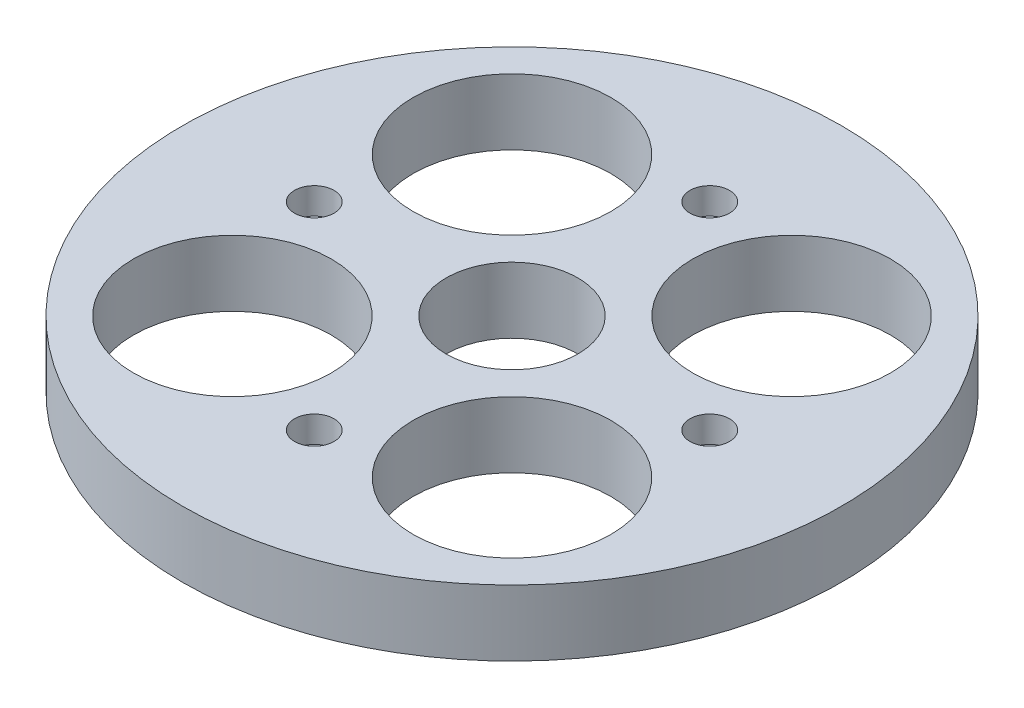
ISO-10303-21;
HEADER;
FILE_DESCRIPTION(('STEP AP214'),'2;1');
FILE_NAME('part.step','',(''),(''),'','','');
FILE_SCHEMA(('AUTOMOTIVE_DESIGN { 1 0 10303 214 1 1 1 1 }'));
ENDSEC;
DATA;
#1=APPLICATION_CONTEXT('core data for automotive mechanical design processes');
#2=APPLICATION_PROTOCOL_DEFINITION('international standard','automotive_design',2000,#1);
#3=PRODUCT_CONTEXT('',#1,'mechanical');
#4=PRODUCT('Part','Part','',(#3));
#5=PRODUCT_RELATED_PRODUCT_CATEGORY('part','',(#4));
#6=PRODUCT_DEFINITION_FORMATION('','',#4);
#7=PRODUCT_DEFINITION_CONTEXT('part definition',#1,'design');
#8=PRODUCT_DEFINITION('design','',#6,#7);
#9=PRODUCT_DEFINITION_SHAPE('','',#8);
#10=(LENGTH_UNIT() NAMED_UNIT(*) SI_UNIT(.MILLI.,.METRE.));
#11=(NAMED_UNIT(*) PLANE_ANGLE_UNIT() SI_UNIT($,.RADIAN.));
#12=(NAMED_UNIT(*) SI_UNIT($,.STERADIAN.) SOLID_ANGLE_UNIT());
#13=UNCERTAINTY_MEASURE_WITH_UNIT(LENGTH_MEASURE(1.E-05),#10,'distance_accuracy_value','');
#14=(GEOMETRIC_REPRESENTATION_CONTEXT(3) GLOBAL_UNCERTAINTY_ASSIGNED_CONTEXT((#13)) GLOBAL_UNIT_ASSIGNED_CONTEXT((#10,
#11,#12)) REPRESENTATION_CONTEXT('',''));
#15=CARTESIAN_POINT('',(0.,0.,0.));
#16=DIRECTION('',(0.,0.,1.));
#17=DIRECTION('',(1.,0.,0.));
#18=AXIS2_PLACEMENT_3D('',#15,#16,#17);
#19=CARTESIAN_POINT('',(-30.,0.,-3.14233320495882E-13));
#20=DIRECTION('',(0.,1.,0.));
#21=DIRECTION('',(0.,0.,1.));
#22=AXIS2_PLACEMENT_3D('',#19,#20,#21);
#23=CYLINDRICAL_SURFACE('',#22,1.5);
#24=CARTESIAN_POINT('',(-30.,6.,-3.14233320495882E-13));
#25=DIRECTION('',(0.,1.,0.));
#26=DIRECTION('',(0.,0.,1.));
#27=AXIS2_PLACEMENT_3D('',#24,#25,#26);
#28=CIRCLE('',#27,1.5);
#29=CARTESIAN_POINT('',(-30.,6.,1.49999999999969));
#30=VERTEX_POINT('',#29);
#31=EDGE_CURVE('E75',#30,#30,#28,.T.);
#32=ORIENTED_EDGE('',*,*,#31,.T.);
#33=EDGE_LOOP('',(#32));
#34=FACE_BOUND('',#33,.T.);
#35=CARTESIAN_POINT('',(-30.,3.,-3.14233320495882E-13));
#36=DIRECTION('',(0.,-1.,0.));
#37=DIRECTION('',(0.,0.,-1.));
#38=AXIS2_PLACEMENT_3D('',#35,#36,#37);
#39=CIRCLE('',#38,1.5);
#40=CARTESIAN_POINT('',(-30.,3.,-1.50000000000031));
#41=VERTEX_POINT('',#40);
#42=EDGE_CURVE('E45',#41,#41,#39,.F.);
#43=ORIENTED_EDGE('',*,*,#42,.F.);
#44=EDGE_LOOP('',(#43));
#45=FACE_BOUND('',#44,.T.);
#46=ADVANCED_FACE('F41',(#34,#45),#23,.F.);
#47=CARTESIAN_POINT('',(-2.09488880330588E-13,0.,30.));
#48=DIRECTION('',(0.,1.,0.));
#49=DIRECTION('',(0.,0.,1.));
#50=AXIS2_PLACEMENT_3D('',#47,#48,#49);
#51=CYLINDRICAL_SURFACE('',#50,1.5);
#52=CARTESIAN_POINT('',(-2.09488880330588E-13,6.,30.));
#53=DIRECTION('',(0.,1.,0.));
#54=DIRECTION('',(0.,0.,1.));
#55=AXIS2_PLACEMENT_3D('',#52,#53,#54);
#56=CIRCLE('',#55,1.5);
#57=CARTESIAN_POINT('',(-2.09488880330588E-13,6.,31.5));
#58=VERTEX_POINT('',#57);
#59=EDGE_CURVE('E79',#58,#58,#56,.T.);
#60=ORIENTED_EDGE('',*,*,#59,.T.);
#61=EDGE_LOOP('',(#60));
#62=FACE_BOUND('',#61,.T.);
#63=CARTESIAN_POINT('',(-2.09488880330588E-13,3.,30.));
#64=DIRECTION('',(0.,-1.,0.));
#65=DIRECTION('',(0.,0.,-1.));
#66=AXIS2_PLACEMENT_3D('',#63,#64,#65);
#67=CIRCLE('',#66,1.5);
#68=CARTESIAN_POINT('',(-2.09488880330588E-13,3.,28.5));
#69=VERTEX_POINT('',#68);
#70=EDGE_CURVE('E70',#69,#69,#67,.F.);
#71=ORIENTED_EDGE('',*,*,#70,.F.);
#72=EDGE_LOOP('',(#71));
#73=FACE_BOUND('',#72,.T.);
#74=ADVANCED_FACE('F212',(#62,#73),#51,.F.);
#75=CARTESIAN_POINT('',(30.,0.,1.04744440165294E-13));
#76=DIRECTION('',(0.,1.,0.));
#77=DIRECTION('',(0.,0.,1.));
#78=AXIS2_PLACEMENT_3D('',#75,#76,#77);
#79=CYLINDRICAL_SURFACE('',#78,1.5);
#80=CARTESIAN_POINT('',(30.,6.,1.04744440165294E-13));
#81=DIRECTION('',(0.,1.,0.));
#82=DIRECTION('',(0.,0.,1.));
#83=AXIS2_PLACEMENT_3D('',#80,#81,#82);
#84=CIRCLE('',#83,1.5);
#85=CARTESIAN_POINT('',(30.,6.,1.50000000000011));
#86=VERTEX_POINT('',#85);
#87=EDGE_CURVE('E84',#86,#86,#84,.T.);
#88=ORIENTED_EDGE('',*,*,#87,.T.);
#89=EDGE_LOOP('',(#88));
#90=FACE_BOUND('',#89,.T.);
#91=CARTESIAN_POINT('',(30.,3.,1.04744440165294E-13));
#92=DIRECTION('',(0.,-1.,0.));
#93=DIRECTION('',(0.,0.,-1.));
#94=AXIS2_PLACEMENT_3D('',#91,#92,#93);
#95=CIRCLE('',#94,1.5);
#96=CARTESIAN_POINT('',(30.,3.,-1.4999999999999));
#97=VERTEX_POINT('',#96);
#98=EDGE_CURVE('E67',#97,#97,#95,.F.);
#99=ORIENTED_EDGE('',*,*,#98,.F.);
#100=EDGE_LOOP('',(#99));
#101=FACE_BOUND('',#100,.T.);
#102=ADVANCED_FACE('F218',(#90,#101),#79,.F.);
#103=CARTESIAN_POINT('',(0.,0.,-30.));
#104=DIRECTION('',(0.,1.,0.));
#105=DIRECTION('',(0.,0.,1.));
#106=AXIS2_PLACEMENT_3D('',#103,#104,#105);
#107=CYLINDRICAL_SURFACE('',#106,1.5);
#108=CARTESIAN_POINT('',(0.,6.,-30.));
#109=DIRECTION('',(0.,1.,0.));
#110=DIRECTION('',(0.,0.,1.));
#111=AXIS2_PLACEMENT_3D('',#108,#109,#110);
#112=CIRCLE('',#111,1.5);
#113=CARTESIAN_POINT('',(0.,6.,-28.5));
#114=VERTEX_POINT('',#113);
#115=EDGE_CURVE('E109',#114,#114,#112,.T.);
#116=ORIENTED_EDGE('',*,*,#115,.T.);
#117=EDGE_LOOP('',(#116));
#118=FACE_BOUND('',#117,.T.);
#119=CARTESIAN_POINT('',(0.,3.,-30.));
#120=DIRECTION('',(0.,-1.,0.));
#121=DIRECTION('',(0.,0.,-1.));
#122=AXIS2_PLACEMENT_3D('',#119,#120,#121);
#123=CIRCLE('',#122,1.5);
#124=CARTESIAN_POINT('',(0.,3.,-31.5));
#125=VERTEX_POINT('',#124);
#126=EDGE_CURVE('E64',#125,#125,#123,.F.);
#127=ORIENTED_EDGE('',*,*,#126,.F.);
#128=EDGE_LOOP('',(#127));
#129=FACE_BOUND('',#128,.T.);
#130=ADVANCED_FACE('F197',(#118,#129),#107,.F.);
#131=CARTESIAN_POINT('',(0.,10.,0.));
#132=DIRECTION('',(0.,-1.,0.));
#133=DIRECTION('',(0.,0.,-1.));
#134=AXIS2_PLACEMENT_3D('',#131,#132,#133);
#135=CYLINDRICAL_SURFACE('',#134,50.);
#136=CARTESIAN_POINT('',(0.,10.,0.));
#137=DIRECTION('',(0.,1.,0.));
#138=DIRECTION('',(0.,0.,1.));
#139=AXIS2_PLACEMENT_3D('',#136,#137,#138);
#140=CIRCLE('',#139,50.);
#141=CARTESIAN_POINT('',(0.,10.,50.));
#142=VERTEX_POINT('',#141);
#143=EDGE_CURVE('E49',#142,#142,#140,.T.);
#144=ORIENTED_EDGE('',*,*,#143,.F.);
#145=EDGE_LOOP('',(#144));
#146=FACE_BOUND('',#145,.T.);
#147=CARTESIAN_POINT('',(0.,0.,0.));
#148=DIRECTION('',(0.,1.,0.));
#149=DIRECTION('',(0.,0.,1.));
#150=AXIS2_PLACEMENT_3D('',#147,#148,#149);
#151=CIRCLE('',#150,50.);
#152=CARTESIAN_POINT('',(0.,0.,50.));
#153=VERTEX_POINT('',#152);
#154=EDGE_CURVE('E58',#153,#153,#151,.T.);
#155=ORIENTED_EDGE('',*,*,#154,.T.);
#156=EDGE_LOOP('',(#155));
#157=FACE_BOUND('',#156,.T.);
#158=ADVANCED_FACE('F43',(#146,#157),#135,.T.);
#159=CARTESIAN_POINT('',(0.,10.,0.));
#160=DIRECTION('',(0.,-1.,0.));
#161=DIRECTION('',(0.,0.,-1.));
#162=AXIS2_PLACEMENT_3D('',#159,#160,#161);
#163=CYLINDRICAL_SURFACE('',#162,10.);
#164=CARTESIAN_POINT('',(0.,10.,0.));
#165=DIRECTION('',(0.,1.,0.));
#166=DIRECTION('',(0.,0.,1.));
#167=AXIS2_PLACEMENT_3D('',#164,#165,#166);
#168=CIRCLE('',#167,10.);
#169=CARTESIAN_POINT('',(0.,10.,10.));
#170=VERTEX_POINT('',#169);
#171=EDGE_CURVE('E10',#170,#170,#168,.T.);
#172=ORIENTED_EDGE('',*,*,#171,.T.);
#173=EDGE_LOOP('',(#172));
#174=FACE_BOUND('',#173,.T.);
#175=CARTESIAN_POINT('',(0.,0.,0.));
#176=DIRECTION('',(0.,1.,0.));
#177=DIRECTION('',(0.,0.,1.));
#178=AXIS2_PLACEMENT_3D('',#175,#176,#177);
#179=CIRCLE('',#178,10.);
#180=CARTESIAN_POINT('',(0.,0.,10.));
#181=VERTEX_POINT('',#180);
#182=EDGE_CURVE('E54',#181,#181,#179,.T.);
#183=ORIENTED_EDGE('',*,*,#182,.F.);
#184=EDGE_LOOP('',(#183));
#185=FACE_BOUND('',#184,.T.);
#186=ADVANCED_FACE('F180',(#174,#185),#163,.F.);
#187=CARTESIAN_POINT('',(0.,10.,0.));
#188=DIRECTION('',(0.,1.,0.));
#189=DIRECTION('',(0.,0.,1.));
#190=AXIS2_PLACEMENT_3D('',#187,#188,#189);
#191=PLANE('',#190);
#192=CARTESIAN_POINT('',(-21.2132034355965,10.,21.2132034355963));
#193=DIRECTION('',(0.,1.,0.));
#194=DIRECTION('',(0.,0.,1.));
#195=AXIS2_PLACEMENT_3D('',#192,#193,#194);
#196=CIRCLE('',#195,15.);
#197=CARTESIAN_POINT('',(-21.2132034355965,10.,36.2132034355963));
#198=VERTEX_POINT('',#197);
#199=EDGE_CURVE('E148',#198,#198,#196,.T.);
#200=ORIENTED_EDGE('',*,*,#199,.F.);
#201=EDGE_LOOP('',(#200));
#202=FACE_BOUND('',#201,.T.);
#203=CARTESIAN_POINT('',(21.2132034355964,10.,21.2132034355965));
#204=DIRECTION('',(0.,1.,0.));
#205=DIRECTION('',(0.,0.,1.));
#206=AXIS2_PLACEMENT_3D('',#203,#204,#205);
#207=CIRCLE('',#206,15.);
#208=CARTESIAN_POINT('',(21.2132034355964,10.,36.2132034355965));
#209=VERTEX_POINT('',#208);
#210=EDGE_CURVE('E154',#209,#209,#207,.T.);
#211=ORIENTED_EDGE('',*,*,#210,.F.);
#212=EDGE_LOOP('',(#211));
#213=FACE_BOUND('',#212,.T.);
#214=CARTESIAN_POINT('',(21.2132034355964,10.,-21.2132034355965));
#215=DIRECTION('',(0.,1.,0.));
#216=DIRECTION('',(0.,0.,1.));
#217=AXIS2_PLACEMENT_3D('',#214,#215,#216);
#218=CIRCLE('',#217,15.);
#219=CARTESIAN_POINT('',(21.2132034355964,10.,-6.21320343559645));
#220=VERTEX_POINT('',#219);
#221=EDGE_CURVE('E160',#220,#220,#218,.T.);
#222=ORIENTED_EDGE('',*,*,#221,.F.);
#223=EDGE_LOOP('',(#222));
#224=FACE_BOUND('',#223,.T.);
#225=CARTESIAN_POINT('',(-21.2132034355962,10.,-21.2132034355966));
#226=DIRECTION('',(0.,1.,0.));
#227=DIRECTION('',(0.,0.,1.));
#228=AXIS2_PLACEMENT_3D('',#225,#226,#227);
#229=CIRCLE('',#228,15.);
#230=CARTESIAN_POINT('',(-21.2132034355962,10.,-6.2132034355966));
#231=VERTEX_POINT('',#230);
#232=EDGE_CURVE('E142',#231,#231,#229,.T.);
#233=ORIENTED_EDGE('',*,*,#232,.F.);
#234=EDGE_LOOP('',(#233));
#235=FACE_BOUND('',#234,.T.);
#236=CARTESIAN_POINT('',(0.,10.,-30.));
#237=DIRECTION('',(0.,1.,0.));
#238=DIRECTION('',(0.,0.,1.));
#239=AXIS2_PLACEMENT_3D('',#236,#237,#238);
#240=CIRCLE('',#239,3.);
#241=CARTESIAN_POINT('',(0.,10.,-27.));
#242=VERTEX_POINT('',#241);
#243=EDGE_CURVE('E90',#242,#242,#240,.T.);
#244=ORIENTED_EDGE('',*,*,#243,.F.);
#245=EDGE_LOOP('',(#244));
#246=FACE_BOUND('',#245,.T.);
#247=CARTESIAN_POINT('',(30.,10.,1.04744440165294E-13));
#248=DIRECTION('',(0.,1.,0.));
#249=DIRECTION('',(0.,0.,1.));
#250=AXIS2_PLACEMENT_3D('',#247,#248,#249);
#251=CIRCLE('',#250,3.);
#252=CARTESIAN_POINT('',(30.,10.,3.0000000000001));
#253=VERTEX_POINT('',#252);
#254=EDGE_CURVE('E96',#253,#253,#251,.T.);
#255=ORIENTED_EDGE('',*,*,#254,.F.);
#256=EDGE_LOOP('',(#255));
#257=FACE_BOUND('',#256,.T.);
#258=CARTESIAN_POINT('',(-30.,10.,-3.14233320495882E-13));
#259=DIRECTION('',(0.,1.,0.));
#260=DIRECTION('',(0.,0.,1.));
#261=AXIS2_PLACEMENT_3D('',#258,#259,#260);
#262=CIRCLE('',#261,3.);
#263=CARTESIAN_POINT('',(-30.,10.,2.99999999999968));
#264=VERTEX_POINT('',#263);
#265=EDGE_CURVE('E102',#264,#264,#262,.T.);
#266=ORIENTED_EDGE('',*,*,#265,.F.);
#267=EDGE_LOOP('',(#266));
#268=FACE_BOUND('',#267,.T.);
#269=CARTESIAN_POINT('',(-2.09488880330588E-13,10.,30.));
#270=DIRECTION('',(0.,1.,0.));
#271=DIRECTION('',(0.,0.,1.));
#272=AXIS2_PLACEMENT_3D('',#269,#270,#271);
#273=CIRCLE('',#272,3.);
#274=CARTESIAN_POINT('',(-2.09488880330588E-13,10.,33.));
#275=VERTEX_POINT('',#274);
#276=EDGE_CURVE('E107',#275,#275,#273,.T.);
#277=ORIENTED_EDGE('',*,*,#276,.F.);
#278=EDGE_LOOP('',(#277));
#279=FACE_BOUND('',#278,.T.);
#280=ORIENTED_EDGE('',*,*,#143,.T.);
#281=EDGE_LOOP('',(#280));
#282=FACE_BOUND('',#281,.T.);
#283=ORIENTED_EDGE('',*,*,#171,.F.);
#284=EDGE_LOOP('',(#283));
#285=FACE_BOUND('',#284,.T.);
#286=ADVANCED_FACE('F177',(#202,#213,#224,#235,#246,#257,#268,#279,#282,#285),#191,.T.);
#287=CARTESIAN_POINT('',(0.,0.,0.));
#288=DIRECTION('',(0.,1.,0.));
#289=DIRECTION('',(0.,0.,1.));
#290=AXIS2_PLACEMENT_3D('',#287,#288,#289);
#291=PLANE('',#290);
#292=CARTESIAN_POINT('',(-21.2132034355965,0.,21.2132034355963));
#293=DIRECTION('',(0.,1.,0.));
#294=DIRECTION('',(0.,0.,1.));
#295=AXIS2_PLACEMENT_3D('',#292,#293,#294);
#296=CIRCLE('',#295,15.);
#297=CARTESIAN_POINT('',(-21.2132034355965,0.,36.2132034355963));
#298=VERTEX_POINT('',#297);
#299=EDGE_CURVE('E151',#298,#298,#296,.T.);
#300=ORIENTED_EDGE('',*,*,#299,.T.);
#301=EDGE_LOOP('',(#300));
#302=FACE_BOUND('',#301,.T.);
#303=CARTESIAN_POINT('',(21.2132034355964,0.,21.2132034355965));
#304=DIRECTION('',(0.,1.,0.));
#305=DIRECTION('',(0.,0.,1.));
#306=AXIS2_PLACEMENT_3D('',#303,#304,#305);
#307=CIRCLE('',#306,15.);
#308=CARTESIAN_POINT('',(21.2132034355964,0.,36.2132034355965));
#309=VERTEX_POINT('',#308);
#310=EDGE_CURVE('E157',#309,#309,#307,.T.);
#311=ORIENTED_EDGE('',*,*,#310,.T.);
#312=EDGE_LOOP('',(#311));
#313=FACE_BOUND('',#312,.T.);
#314=CARTESIAN_POINT('',(21.2132034355964,0.,-21.2132034355965));
#315=DIRECTION('',(0.,1.,0.));
#316=DIRECTION('',(0.,0.,1.));
#317=AXIS2_PLACEMENT_3D('',#314,#315,#316);
#318=CIRCLE('',#317,15.);
#319=CARTESIAN_POINT('',(21.2132034355964,0.,-6.21320343559645));
#320=VERTEX_POINT('',#319);
#321=EDGE_CURVE('E145',#320,#320,#318,.T.);
#322=ORIENTED_EDGE('',*,*,#321,.T.);
#323=EDGE_LOOP('',(#322));
#324=FACE_BOUND('',#323,.T.);
#325=CARTESIAN_POINT('',(-21.2132034355962,0.,-21.2132034355966));
#326=DIRECTION('',(0.,1.,0.));
#327=DIRECTION('',(0.,0.,1.));
#328=AXIS2_PLACEMENT_3D('',#325,#326,#327);
#329=CIRCLE('',#328,15.);
#330=CARTESIAN_POINT('',(-21.2132034355962,0.,-6.2132034355966));
#331=VERTEX_POINT('',#330);
#332=EDGE_CURVE('E122',#331,#331,#329,.T.);
#333=ORIENTED_EDGE('',*,*,#332,.T.);
#334=EDGE_LOOP('',(#333));
#335=FACE_BOUND('',#334,.T.);
#336=CARTESIAN_POINT('',(0.,0.,30.));
#337=DIRECTION('',(0.,-1.,0.));
#338=DIRECTION('',(0.,0.,-1.));
#339=AXIS2_PLACEMENT_3D('',#336,#337,#338);
#340=CIRCLE('',#339,3.);
#341=CARTESIAN_POINT('',(0.,0.,27.));
#342=VERTEX_POINT('',#341);
#343=EDGE_CURVE('E137',#342,#342,#340,.T.);
#344=ORIENTED_EDGE('',*,*,#343,.F.);
#345=EDGE_LOOP('',(#344));
#346=FACE_BOUND('',#345,.T.);
#347=CARTESIAN_POINT('',(30.,0.,-1.04744440165294E-13));
#348=DIRECTION('',(0.,-1.,0.));
#349=DIRECTION('',(0.,0.,-1.));
#350=AXIS2_PLACEMENT_3D('',#347,#348,#349);
#351=CIRCLE('',#350,3.);
#352=CARTESIAN_POINT('',(30.,0.,-3.0000000000001));
#353=VERTEX_POINT('',#352);
#354=EDGE_CURVE('E134',#353,#353,#351,.T.);
#355=ORIENTED_EDGE('',*,*,#354,.F.);
#356=EDGE_LOOP('',(#355));
#357=FACE_BOUND('',#356,.T.);
#358=CARTESIAN_POINT('',(-2.09488880330588E-13,0.,-30.));
#359=DIRECTION('',(0.,-1.,0.));
#360=DIRECTION('',(0.,0.,-1.));
#361=AXIS2_PLACEMENT_3D('',#358,#359,#360);
#362=CIRCLE('',#361,3.);
#363=CARTESIAN_POINT('',(-2.09488880330588E-13,0.,-33.));
#364=VERTEX_POINT('',#363);
#365=EDGE_CURVE('E128',#364,#364,#362,.T.);
#366=ORIENTED_EDGE('',*,*,#365,.F.);
#367=EDGE_LOOP('',(#366));
#368=FACE_BOUND('',#367,.T.);
#369=CARTESIAN_POINT('',(-30.,0.,3.14233320495882E-13));
#370=DIRECTION('',(0.,-1.,0.));
#371=DIRECTION('',(0.,0.,-1.));
#372=AXIS2_PLACEMENT_3D('',#369,#370,#371);
#373=CIRCLE('',#372,3.);
#374=CARTESIAN_POINT('',(-30.,0.,-2.99999999999968));
#375=VERTEX_POINT('',#374);
#376=EDGE_CURVE('E121',#375,#375,#373,.T.);
#377=ORIENTED_EDGE('',*,*,#376,.F.);
#378=EDGE_LOOP('',(#377));
#379=FACE_BOUND('',#378,.T.);
#380=ORIENTED_EDGE('',*,*,#154,.F.);
#381=EDGE_LOOP('',(#380));
#382=FACE_BOUND('',#381,.T.);
#383=ORIENTED_EDGE('',*,*,#182,.T.);
#384=EDGE_LOOP('',(#383));
#385=FACE_BOUND('',#384,.T.);
#386=ADVANCED_FACE('F166',(#302,#313,#324,#335,#346,#357,#368,#379,#382,#385),#291,.F.);
#387=CARTESIAN_POINT('',(-2.09488880330588E-13,6.,30.));
#388=DIRECTION('',(0.,1.,0.));
#389=DIRECTION('',(0.,0.,1.));
#390=AXIS2_PLACEMENT_3D('',#387,#388,#389);
#391=CYLINDRICAL_SURFACE('',#390,3.);
#392=CARTESIAN_POINT('',(-2.09488880330588E-13,6.,30.));
#393=DIRECTION('',(0.,1.,0.));
#394=DIRECTION('',(0.,0.,1.));
#395=AXIS2_PLACEMENT_3D('',#392,#393,#394);
#396=CIRCLE('',#395,3.);
#397=CARTESIAN_POINT('',(-2.09488880330588E-13,6.,33.));
#398=VERTEX_POINT('',#397);
#399=EDGE_CURVE('E105',#398,#398,#396,.T.);
#400=ORIENTED_EDGE('',*,*,#399,.F.);
#401=EDGE_LOOP('',(#400));
#402=FACE_BOUND('',#401,.T.);
#403=ORIENTED_EDGE('',*,*,#276,.T.);
#404=EDGE_LOOP('',(#403));
#405=FACE_BOUND('',#404,.T.);
#406=ADVANCED_FACE('F202',(#402,#405),#391,.F.);
#407=CARTESIAN_POINT('',(0.,6.,0.));
#408=DIRECTION('',(0.,1.,0.));
#409=DIRECTION('',(0.,0.,1.));
#410=AXIS2_PLACEMENT_3D('',#407,#408,#409);
#411=PLANE('',#410);
#412=ORIENTED_EDGE('',*,*,#59,.F.);
#413=EDGE_LOOP('',(#412));
#414=FACE_BOUND('',#413,.T.);
#415=ORIENTED_EDGE('',*,*,#399,.T.);
#416=EDGE_LOOP('',(#415));
#417=FACE_BOUND('',#416,.T.);
#418=ADVANCED_FACE('F247',(#414,#417),#411,.T.);
#419=CARTESIAN_POINT('',(-30.,6.,-3.14233320495882E-13));
#420=DIRECTION('',(0.,1.,0.));
#421=DIRECTION('',(0.,0.,1.));
#422=AXIS2_PLACEMENT_3D('',#419,#420,#421);
#423=CYLINDRICAL_SURFACE('',#422,3.);
#424=CARTESIAN_POINT('',(-30.,6.,-3.14233320495882E-13));
#425=DIRECTION('',(0.,1.,0.));
#426=DIRECTION('',(0.,0.,1.));
#427=AXIS2_PLACEMENT_3D('',#424,#425,#426);
#428=CIRCLE('',#427,3.);
#429=CARTESIAN_POINT('',(-30.,6.,2.99999999999968));
#430=VERTEX_POINT('',#429);
#431=EDGE_CURVE('E99',#430,#430,#428,.T.);
#432=ORIENTED_EDGE('',*,*,#431,.F.);
#433=EDGE_LOOP('',(#432));
#434=FACE_BOUND('',#433,.T.);
#435=ORIENTED_EDGE('',*,*,#265,.T.);
#436=EDGE_LOOP('',(#435));
#437=FACE_BOUND('',#436,.T.);
#438=ADVANCED_FACE('F243',(#434,#437),#423,.F.);
#439=CARTESIAN_POINT('',(0.,6.,0.));
#440=DIRECTION('',(0.,1.,0.));
#441=DIRECTION('',(0.,0.,1.));
#442=AXIS2_PLACEMENT_3D('',#439,#440,#441);
#443=PLANE('',#442);
#444=ORIENTED_EDGE('',*,*,#31,.F.);
#445=EDGE_LOOP('',(#444));
#446=FACE_BOUND('',#445,.T.);
#447=ORIENTED_EDGE('',*,*,#431,.T.);
#448=EDGE_LOOP('',(#447));
#449=FACE_BOUND('',#448,.T.);
#450=ADVANCED_FACE('F239',(#446,#449),#443,.T.);
#451=CARTESIAN_POINT('',(30.,6.,1.04744440165294E-13));
#452=DIRECTION('',(0.,1.,0.));
#453=DIRECTION('',(0.,0.,1.));
#454=AXIS2_PLACEMENT_3D('',#451,#452,#453);
#455=CYLINDRICAL_SURFACE('',#454,3.);
#456=CARTESIAN_POINT('',(30.,6.,1.04744440165294E-13));
#457=DIRECTION('',(0.,1.,0.));
#458=DIRECTION('',(0.,0.,1.));
#459=AXIS2_PLACEMENT_3D('',#456,#457,#458);
#460=CIRCLE('',#459,3.);
#461=CARTESIAN_POINT('',(30.,6.,3.0000000000001));
#462=VERTEX_POINT('',#461);
#463=EDGE_CURVE('E93',#462,#462,#460,.T.);
#464=ORIENTED_EDGE('',*,*,#463,.F.);
#465=EDGE_LOOP('',(#464));
#466=FACE_BOUND('',#465,.T.);
#467=ORIENTED_EDGE('',*,*,#254,.T.);
#468=EDGE_LOOP('',(#467));
#469=FACE_BOUND('',#468,.T.);
#470=ADVANCED_FACE('F235',(#466,#469),#455,.F.);
#471=CARTESIAN_POINT('',(0.,6.,0.));
#472=DIRECTION('',(0.,1.,0.));
#473=DIRECTION('',(0.,0.,1.));
#474=AXIS2_PLACEMENT_3D('',#471,#472,#473);
#475=PLANE('',#474);
#476=ORIENTED_EDGE('',*,*,#87,.F.);
#477=EDGE_LOOP('',(#476));
#478=FACE_BOUND('',#477,.T.);
#479=ORIENTED_EDGE('',*,*,#463,.T.);
#480=EDGE_LOOP('',(#479));
#481=FACE_BOUND('',#480,.T.);
#482=ADVANCED_FACE('F231',(#478,#481),#475,.T.);
#483=CARTESIAN_POINT('',(0.,6.,-30.));
#484=DIRECTION('',(0.,1.,0.));
#485=DIRECTION('',(0.,0.,1.));
#486=AXIS2_PLACEMENT_3D('',#483,#484,#485);
#487=CYLINDRICAL_SURFACE('',#486,3.);
#488=CARTESIAN_POINT('',(0.,6.,-30.));
#489=DIRECTION('',(0.,1.,0.));
#490=DIRECTION('',(0.,0.,1.));
#491=AXIS2_PLACEMENT_3D('',#488,#489,#490);
#492=CIRCLE('',#491,3.);
#493=CARTESIAN_POINT('',(0.,6.,-27.));
#494=VERTEX_POINT('',#493);
#495=EDGE_CURVE('E61',#494,#494,#492,.T.);
#496=ORIENTED_EDGE('',*,*,#495,.F.);
#497=EDGE_LOOP('',(#496));
#498=FACE_BOUND('',#497,.T.);
#499=ORIENTED_EDGE('',*,*,#243,.T.);
#500=EDGE_LOOP('',(#499));
#501=FACE_BOUND('',#500,.T.);
#502=ADVANCED_FACE('F227',(#498,#501),#487,.F.);
#503=CARTESIAN_POINT('',(0.,6.,0.));
#504=DIRECTION('',(0.,1.,0.));
#505=DIRECTION('',(0.,0.,1.));
#506=AXIS2_PLACEMENT_3D('',#503,#504,#505);
#507=PLANE('',#506);
#508=ORIENTED_EDGE('',*,*,#115,.F.);
#509=EDGE_LOOP('',(#508));
#510=FACE_BOUND('',#509,.T.);
#511=ORIENTED_EDGE('',*,*,#495,.T.);
#512=EDGE_LOOP('',(#511));
#513=FACE_BOUND('',#512,.T.);
#514=ADVANCED_FACE('F224',(#510,#513),#507,.T.);
#515=CARTESIAN_POINT('',(-2.09488880330588E-13,3.,-30.));
#516=DIRECTION('',(0.,-1.,0.));
#517=DIRECTION('',(0.,0.,-1.));
#518=AXIS2_PLACEMENT_3D('',#515,#516,#517);
#519=PLANE('',#518);
#520=CARTESIAN_POINT('',(-2.09488880330588E-13,3.,-30.));
#521=DIRECTION('',(0.,-1.,0.));
#522=DIRECTION('',(0.,0.,-1.));
#523=AXIS2_PLACEMENT_3D('',#520,#521,#522);
#524=CIRCLE('',#523,3.);
#525=CARTESIAN_POINT('',(-2.09488880330588E-13,3.,-33.));
#526=VERTEX_POINT('',#525);
#527=EDGE_CURVE('E125',#526,#526,#524,.T.);
#528=ORIENTED_EDGE('',*,*,#527,.T.);
#529=EDGE_LOOP('',(#528));
#530=FACE_BOUND('',#529,.T.);
#531=ORIENTED_EDGE('',*,*,#126,.T.);
#532=EDGE_LOOP('',(#531));
#533=FACE_BOUND('',#532,.T.);
#534=ADVANCED_FACE('F226',(#530,#533),#519,.T.);
#535=CARTESIAN_POINT('',(-2.09488880330588E-13,3.,-30.));
#536=DIRECTION('',(0.,-1.,0.));
#537=DIRECTION('',(0.,0.,-1.));
#538=AXIS2_PLACEMENT_3D('',#535,#536,#537);
#539=CYLINDRICAL_SURFACE('',#538,3.);
#540=ORIENTED_EDGE('',*,*,#527,.F.);
#541=EDGE_LOOP('',(#540));
#542=FACE_BOUND('',#541,.T.);
#543=ORIENTED_EDGE('',*,*,#365,.T.);
#544=EDGE_LOOP('',(#543));
#545=FACE_BOUND('',#544,.T.);
#546=ADVANCED_FACE('F331',(#542,#545),#539,.F.);
#547=CARTESIAN_POINT('',(30.,3.,-1.04744440165294E-13));
#548=DIRECTION('',(0.,-1.,0.));
#549=DIRECTION('',(0.,0.,-1.));
#550=AXIS2_PLACEMENT_3D('',#547,#548,#549);
#551=PLANE('',#550);
#552=CARTESIAN_POINT('',(30.,3.,-1.04744440165294E-13));
#553=DIRECTION('',(0.,-1.,0.));
#554=DIRECTION('',(0.,0.,-1.));
#555=AXIS2_PLACEMENT_3D('',#552,#553,#554);
#556=CIRCLE('',#555,3.);
#557=CARTESIAN_POINT('',(30.,3.,-3.0000000000001));
#558=VERTEX_POINT('',#557);
#559=EDGE_CURVE('E131',#558,#558,#556,.T.);
#560=ORIENTED_EDGE('',*,*,#559,.T.);
#561=EDGE_LOOP('',(#560));
#562=FACE_BOUND('',#561,.T.);
#563=ORIENTED_EDGE('',*,*,#98,.T.);
#564=EDGE_LOOP('',(#563));
#565=FACE_BOUND('',#564,.T.);
#566=ADVANCED_FACE('F341',(#562,#565),#551,.T.);
#567=CARTESIAN_POINT('',(30.,3.,-1.04744440165294E-13));
#568=DIRECTION('',(0.,-1.,0.));
#569=DIRECTION('',(0.,0.,-1.));
#570=AXIS2_PLACEMENT_3D('',#567,#568,#569);
#571=CYLINDRICAL_SURFACE('',#570,3.);
#572=ORIENTED_EDGE('',*,*,#559,.F.);
#573=EDGE_LOOP('',(#572));
#574=FACE_BOUND('',#573,.T.);
#575=ORIENTED_EDGE('',*,*,#354,.T.);
#576=EDGE_LOOP('',(#575));
#577=FACE_BOUND('',#576,.T.);
#578=ADVANCED_FACE('F351',(#574,#577),#571,.F.);
#579=CARTESIAN_POINT('',(0.,3.,30.));
#580=DIRECTION('',(0.,-1.,0.));
#581=DIRECTION('',(0.,0.,-1.));
#582=AXIS2_PLACEMENT_3D('',#579,#580,#581);
#583=PLANE('',#582);
#584=CARTESIAN_POINT('',(0.,3.,30.));
#585=DIRECTION('',(0.,-1.,0.));
#586=DIRECTION('',(0.,0.,-1.));
#587=AXIS2_PLACEMENT_3D('',#584,#585,#586);
#588=CIRCLE('',#587,3.);
#589=CARTESIAN_POINT('',(0.,3.,27.));
#590=VERTEX_POINT('',#589);
#591=EDGE_CURVE('E68',#590,#590,#588,.T.);
#592=ORIENTED_EDGE('',*,*,#591,.T.);
#593=EDGE_LOOP('',(#592));
#594=FACE_BOUND('',#593,.T.);
#595=ORIENTED_EDGE('',*,*,#70,.T.);
#596=EDGE_LOOP('',(#595));
#597=FACE_BOUND('',#596,.T.);
#598=ADVANCED_FACE('F361',(#594,#597),#583,.T.);
#599=CARTESIAN_POINT('',(0.,3.,30.));
#600=DIRECTION('',(0.,-1.,0.));
#601=DIRECTION('',(0.,0.,-1.));
#602=AXIS2_PLACEMENT_3D('',#599,#600,#601);
#603=CYLINDRICAL_SURFACE('',#602,3.);
#604=ORIENTED_EDGE('',*,*,#591,.F.);
#605=EDGE_LOOP('',(#604));
#606=FACE_BOUND('',#605,.T.);
#607=ORIENTED_EDGE('',*,*,#343,.T.);
#608=EDGE_LOOP('',(#607));
#609=FACE_BOUND('',#608,.T.);
#610=ADVANCED_FACE('F371',(#606,#609),#603,.F.);
#611=CARTESIAN_POINT('',(-30.,3.,3.14233320495882E-13));
#612=DIRECTION('',(0.,-1.,0.));
#613=DIRECTION('',(0.,0.,-1.));
#614=AXIS2_PLACEMENT_3D('',#611,#612,#613);
#615=PLANE('',#614);
#616=CARTESIAN_POINT('',(-30.,3.,3.14233320495882E-13));
#617=DIRECTION('',(0.,-1.,0.));
#618=DIRECTION('',(0.,0.,-1.));
#619=AXIS2_PLACEMENT_3D('',#616,#617,#618);
#620=CIRCLE('',#619,3.);
#621=CARTESIAN_POINT('',(-30.,3.,-2.99999999999968));
#622=VERTEX_POINT('',#621);
#623=EDGE_CURVE('E118',#622,#622,#620,.T.);
#624=ORIENTED_EDGE('',*,*,#623,.T.);
#625=EDGE_LOOP('',(#624));
#626=FACE_BOUND('',#625,.T.);
#627=ORIENTED_EDGE('',*,*,#42,.T.);
#628=EDGE_LOOP('',(#627));
#629=FACE_BOUND('',#628,.T.);
#630=ADVANCED_FACE('F381',(#626,#629),#615,.T.);
#631=CARTESIAN_POINT('',(-30.,3.,3.14233320495882E-13));
#632=DIRECTION('',(0.,-1.,0.));
#633=DIRECTION('',(0.,0.,-1.));
#634=AXIS2_PLACEMENT_3D('',#631,#632,#633);
#635=CYLINDRICAL_SURFACE('',#634,3.);
#636=ORIENTED_EDGE('',*,*,#623,.F.);
#637=EDGE_LOOP('',(#636));
#638=FACE_BOUND('',#637,.T.);
#639=ORIENTED_EDGE('',*,*,#376,.T.);
#640=EDGE_LOOP('',(#639));
#641=FACE_BOUND('',#640,.T.);
#642=ADVANCED_FACE('F391',(#638,#641),#635,.F.);
#643=CARTESIAN_POINT('',(-21.2132034355962,0.,-21.2132034355966));
#644=DIRECTION('',(0.,1.,0.));
#645=DIRECTION('',(0.,0.,1.));
#646=AXIS2_PLACEMENT_3D('',#643,#644,#645);
#647=CYLINDRICAL_SURFACE('',#646,15.);
#648=ORIENTED_EDGE('',*,*,#332,.F.);
#649=EDGE_LOOP('',(#648));
#650=FACE_BOUND('',#649,.T.);
#651=ORIENTED_EDGE('',*,*,#232,.T.);
#652=EDGE_LOOP('',(#651));
#653=FACE_BOUND('',#652,.T.);
#654=ADVANCED_FACE('F173',(#650,#653),#647,.F.);
#655=CARTESIAN_POINT('',(21.2132034355964,0.,-21.2132034355965));
#656=DIRECTION('',(0.,1.,0.));
#657=DIRECTION('',(0.,0.,1.));
#658=AXIS2_PLACEMENT_3D('',#655,#656,#657);
#659=CYLINDRICAL_SURFACE('',#658,15.);
#660=ORIENTED_EDGE('',*,*,#321,.F.);
#661=EDGE_LOOP('',(#660));
#662=FACE_BOUND('',#661,.T.);
#663=ORIENTED_EDGE('',*,*,#221,.T.);
#664=EDGE_LOOP('',(#663));
#665=FACE_BOUND('',#664,.T.);
#666=ADVANCED_FACE('F169',(#662,#665),#659,.F.);
#667=CARTESIAN_POINT('',(21.2132034355964,0.,21.2132034355965));
#668=DIRECTION('',(0.,1.,0.));
#669=DIRECTION('',(0.,0.,1.));
#670=AXIS2_PLACEMENT_3D('',#667,#668,#669);
#671=CYLINDRICAL_SURFACE('',#670,15.);
#672=ORIENTED_EDGE('',*,*,#310,.F.);
#673=EDGE_LOOP('',(#672));
#674=FACE_BOUND('',#673,.T.);
#675=ORIENTED_EDGE('',*,*,#210,.T.);
#676=EDGE_LOOP('',(#675));
#677=FACE_BOUND('',#676,.T.);
#678=ADVANCED_FACE('F172',(#674,#677),#671,.F.);
#679=CARTESIAN_POINT('',(-21.2132034355965,0.,21.2132034355963));
#680=DIRECTION('',(0.,1.,0.));
#681=DIRECTION('',(0.,0.,1.));
#682=AXIS2_PLACEMENT_3D('',#679,#680,#681);
#683=CYLINDRICAL_SURFACE('',#682,15.);
#684=ORIENTED_EDGE('',*,*,#299,.F.);
#685=EDGE_LOOP('',(#684));
#686=FACE_BOUND('',#685,.T.);
#687=ORIENTED_EDGE('',*,*,#199,.T.);
#688=EDGE_LOOP('',(#687));
#689=FACE_BOUND('',#688,.T.);
#690=ADVANCED_FACE('F425',(#686,#689),#683,.F.);
#691=CLOSED_SHELL('',(#46,#74,#102,#130,#158,#186,#286,#386,#406,#418,#438,#450,#470,#482,#502,
#514,#534,#546,#566,#578,#598,#610,#630,#642,#654,#666,#678,#690));
#692=MANIFOLD_SOLID_BREP('B2',#691);
#693=ADVANCED_BREP_SHAPE_REPRESENTATION('',(#18,#692),#14);
#694=SHAPE_DEFINITION_REPRESENTATION(#9,#693);
ENDSEC;
END-ISO-10303-21;
